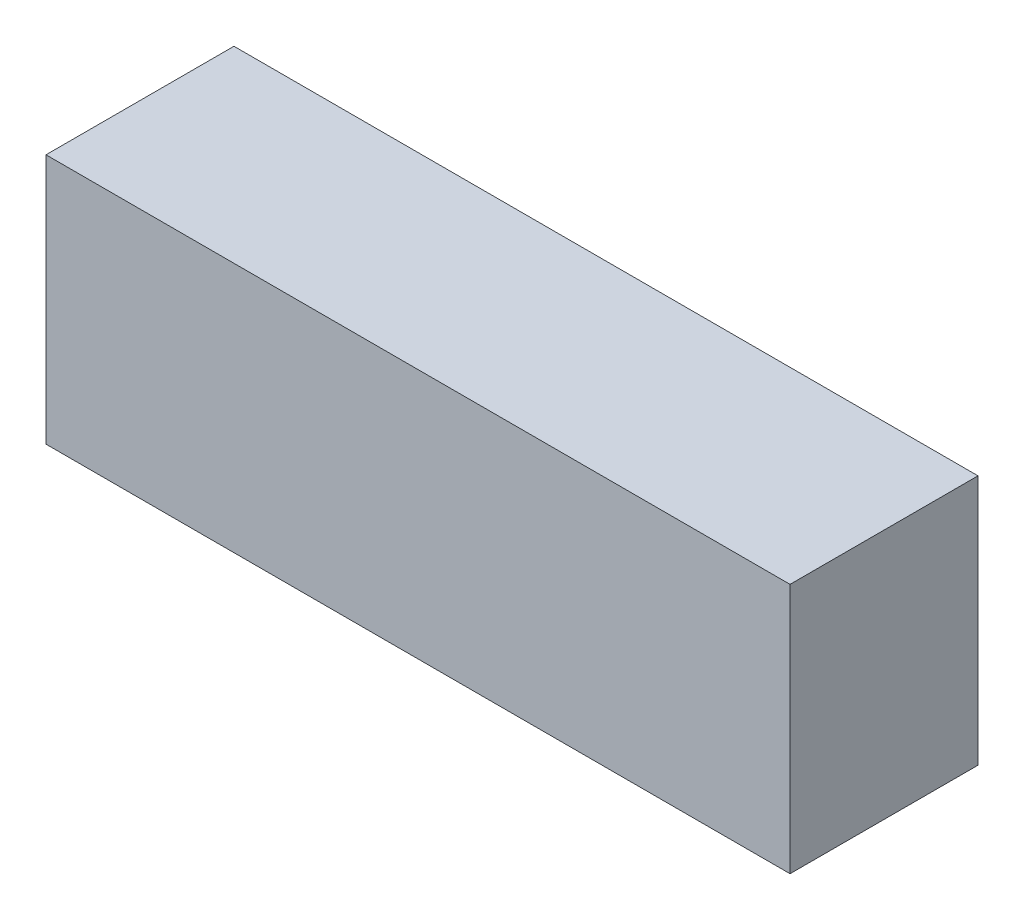
ISO-10303-21;
HEADER;
FILE_DESCRIPTION(('STEP AP214'),'2;1');
FILE_NAME('part.step','',(''),(''),'','','');
FILE_SCHEMA(('AUTOMOTIVE_DESIGN { 1 0 10303 214 1 1 1 1 }'));
ENDSEC;
DATA;
#1=APPLICATION_CONTEXT('core data for automotive mechanical design processes');
#2=APPLICATION_PROTOCOL_DEFINITION('international standard','automotive_design',2000,#1);
#3=PRODUCT_CONTEXT('',#1,'mechanical');
#4=PRODUCT('Part','Part','',(#3));
#5=PRODUCT_RELATED_PRODUCT_CATEGORY('part','',(#4));
#6=PRODUCT_DEFINITION_FORMATION('','',#4);
#7=PRODUCT_DEFINITION_CONTEXT('part definition',#1,'design');
#8=PRODUCT_DEFINITION('design','',#6,#7);
#9=PRODUCT_DEFINITION_SHAPE('','',#8);
#10=(LENGTH_UNIT() NAMED_UNIT(*) SI_UNIT(.MILLI.,.METRE.));
#11=(NAMED_UNIT(*) PLANE_ANGLE_UNIT() SI_UNIT($,.RADIAN.));
#12=(NAMED_UNIT(*) SI_UNIT($,.STERADIAN.) SOLID_ANGLE_UNIT());
#13=UNCERTAINTY_MEASURE_WITH_UNIT(LENGTH_MEASURE(1.E-05),#10,'distance_accuracy_value','');
#14=(GEOMETRIC_REPRESENTATION_CONTEXT(3) GLOBAL_UNCERTAINTY_ASSIGNED_CONTEXT((#13)) GLOBAL_UNIT_ASSIGNED_CONTEXT((#10,
#11,#12)) REPRESENTATION_CONTEXT('',''));
#15=CARTESIAN_POINT('',(0.,0.,0.));
#16=DIRECTION('',(0.,0.,1.));
#17=DIRECTION('',(1.,0.,0.));
#18=AXIS2_PLACEMENT_3D('',#15,#16,#17);
#19=CARTESIAN_POINT('',(0.,-173.,24.));
#20=DIRECTION('',(0.,0.,1.));
#21=DIRECTION('',(1.,0.,0.));
#22=AXIS2_PLACEMENT_3D('',#19,#20,#21);
#23=PLANE('',#22);
#24=CARTESIAN_POINT('',(0.,-173.,24.));
#25=CARTESIAN_POINT('',(95.,-173.,24.));
#26=(BOUNDED_CURVE() B_SPLINE_CURVE(1,(#24,#25),.UNSPECIFIED.,.F.,
.F.) B_SPLINE_CURVE_WITH_KNOTS((2,2),(0.,95.),
.UNSPECIFIED.) CURVE() GEOMETRIC_REPRESENTATION_ITEM() RATIONAL_B_SPLINE_CURVE((1.,1.)) REPRESENTATION_ITEM(''));
#27=CARTESIAN_POINT('',(0.,-173.,24.));
#28=VERTEX_POINT('',#27);
#29=CARTESIAN_POINT('',(95.,-173.,24.));
#30=VERTEX_POINT('',#29);
#31=EDGE_CURVE('E83',#28,#30,#26,.T.);
#32=ORIENTED_EDGE('',*,*,#31,.T.);
#33=CARTESIAN_POINT('',(95.,-173.,24.));
#34=CARTESIAN_POINT('',(95.,-141.,24.));
#35=(BOUNDED_CURVE() B_SPLINE_CURVE(1,(#33,#34),.UNSPECIFIED.,.F.,
.F.) B_SPLINE_CURVE_WITH_KNOTS((2,2),(95.,127.),
.UNSPECIFIED.) CURVE() GEOMETRIC_REPRESENTATION_ITEM() RATIONAL_B_SPLINE_CURVE((1.,1.)) REPRESENTATION_ITEM(''));
#36=CARTESIAN_POINT('',(95.,-141.,24.));
#37=VERTEX_POINT('',#36);
#38=EDGE_CURVE('E100',#30,#37,#35,.T.);
#39=ORIENTED_EDGE('',*,*,#38,.T.);
#40=CARTESIAN_POINT('',(95.,-141.,24.));
#41=CARTESIAN_POINT('',(0.,-141.,24.));
#42=(BOUNDED_CURVE() B_SPLINE_CURVE(1,(#40,#41),.UNSPECIFIED.,.F.,
.F.) B_SPLINE_CURVE_WITH_KNOTS((2,2),(127.,222.),
.UNSPECIFIED.) CURVE() GEOMETRIC_REPRESENTATION_ITEM() RATIONAL_B_SPLINE_CURVE((1.,1.)) REPRESENTATION_ITEM(''));
#43=CARTESIAN_POINT('',(0.,-141.,24.));
#44=VERTEX_POINT('',#43);
#45=EDGE_CURVE('E75',#37,#44,#42,.T.);
#46=ORIENTED_EDGE('',*,*,#45,.T.);
#47=CARTESIAN_POINT('',(0.,-141.,24.));
#48=CARTESIAN_POINT('',(0.,-173.,24.));
#49=(BOUNDED_CURVE() B_SPLINE_CURVE(1,(#47,#48),.UNSPECIFIED.,.F.,
.F.) B_SPLINE_CURVE_WITH_KNOTS((2,2),(222.,254.),
.UNSPECIFIED.) CURVE() GEOMETRIC_REPRESENTATION_ITEM() RATIONAL_B_SPLINE_CURVE((1.,1.)) REPRESENTATION_ITEM(''));
#50=EDGE_CURVE('E10',#44,#28,#49,.T.);
#51=ORIENTED_EDGE('',*,*,#50,.T.);
#52=EDGE_LOOP('',(#32,#39,#46,#51));
#53=FACE_BOUND('',#52,.T.);
#54=ADVANCED_FACE('F16',(#53),#23,.T.);
#55=CARTESIAN_POINT('',(0.,-173.,0.));
#56=DIRECTION('',(0.,0.,-1.));
#57=DIRECTION('',(0.,-1.,0.));
#58=AXIS2_PLACEMENT_3D('',#55,#56,#57);
#59=PLANE('',#58);
#60=CARTESIAN_POINT('',(0.,-141.,0.));
#61=CARTESIAN_POINT('',(0.,-173.,0.));
#62=(BOUNDED_CURVE() B_SPLINE_CURVE(1,(#60,#61),.UNSPECIFIED.,.F.,
.F.) B_SPLINE_CURVE_WITH_KNOTS((2,2),(222.,254.),
.UNSPECIFIED.) CURVE() GEOMETRIC_REPRESENTATION_ITEM() RATIONAL_B_SPLINE_CURVE((1.,1.)) REPRESENTATION_ITEM(''));
#63=CARTESIAN_POINT('',(0.,-141.,0.));
#64=VERTEX_POINT('',#63);
#65=CARTESIAN_POINT('',(0.,-173.,0.));
#66=VERTEX_POINT('',#65);
#67=EDGE_CURVE('E26',#64,#66,#62,.T.);
#68=ORIENTED_EDGE('',*,*,#67,.F.);
#69=CARTESIAN_POINT('',(95.,-141.,0.));
#70=CARTESIAN_POINT('',(0.,-141.,0.));
#71=(BOUNDED_CURVE() B_SPLINE_CURVE(1,(#69,#70),.UNSPECIFIED.,.F.,
.F.) B_SPLINE_CURVE_WITH_KNOTS((2,2),(127.,222.),
.UNSPECIFIED.) CURVE() GEOMETRIC_REPRESENTATION_ITEM() RATIONAL_B_SPLINE_CURVE((1.,1.)) REPRESENTATION_ITEM(''));
#72=CARTESIAN_POINT('',(95.,-141.,0.));
#73=VERTEX_POINT('',#72);
#74=EDGE_CURVE('E142',#73,#64,#71,.T.);
#75=ORIENTED_EDGE('',*,*,#74,.F.);
#76=CARTESIAN_POINT('',(95.,-173.,0.));
#77=CARTESIAN_POINT('',(95.,-141.,0.));
#78=(BOUNDED_CURVE() B_SPLINE_CURVE(1,(#76,#77),.UNSPECIFIED.,.F.,
.F.) B_SPLINE_CURVE_WITH_KNOTS((2,2),(95.,127.),
.UNSPECIFIED.) CURVE() GEOMETRIC_REPRESENTATION_ITEM() RATIONAL_B_SPLINE_CURVE((1.,1.)) REPRESENTATION_ITEM(''));
#79=CARTESIAN_POINT('',(95.,-173.,0.));
#80=VERTEX_POINT('',#79);
#81=EDGE_CURVE('E85',#80,#73,#78,.T.);
#82=ORIENTED_EDGE('',*,*,#81,.F.);
#83=CARTESIAN_POINT('',(0.,-173.,0.));
#84=CARTESIAN_POINT('',(95.,-173.,0.));
#85=(BOUNDED_CURVE() B_SPLINE_CURVE(1,(#83,#84),.UNSPECIFIED.,.F.,
.F.) B_SPLINE_CURVE_WITH_KNOTS((2,2),(0.,95.),
.UNSPECIFIED.) CURVE() GEOMETRIC_REPRESENTATION_ITEM() RATIONAL_B_SPLINE_CURVE((1.,1.)) REPRESENTATION_ITEM(''));
#86=EDGE_CURVE('E81',#66,#80,#85,.T.);
#87=ORIENTED_EDGE('',*,*,#86,.F.);
#88=EDGE_LOOP('',(#68,#75,#82,#87));
#89=FACE_BOUND('',#88,.T.);
#90=ADVANCED_FACE('F87',(#89),#59,.T.);
#91=CARTESIAN_POINT('',(0.,-141.,0.));
#92=DIRECTION('',(-1.,0.,0.));
#93=DIRECTION('',(0.,0.,1.));
#94=AXIS2_PLACEMENT_3D('',#91,#92,#93);
#95=PLANE('',#94);
#96=ORIENTED_EDGE('',*,*,#67,.T.);
#97=CARTESIAN_POINT('',(0.,-173.,0.));
#98=CARTESIAN_POINT('',(0.,-173.,24.));
#99=(BOUNDED_CURVE() B_SPLINE_CURVE(1,(#97,#98),.UNSPECIFIED.,.F.,
.F.) B_SPLINE_CURVE_WITH_KNOTS((2,2),(0.,24.),
.UNSPECIFIED.) CURVE() GEOMETRIC_REPRESENTATION_ITEM() RATIONAL_B_SPLINE_CURVE((1.,1.)) REPRESENTATION_ITEM(''));
#100=EDGE_CURVE('E69',#66,#28,#99,.T.);
#101=ORIENTED_EDGE('',*,*,#100,.T.);
#102=ORIENTED_EDGE('',*,*,#50,.F.);
#103=CARTESIAN_POINT('',(0.,-141.,0.));
#104=CARTESIAN_POINT('',(0.,-141.,24.));
#105=(BOUNDED_CURVE() B_SPLINE_CURVE(1,(#103,#104),.UNSPECIFIED.,.F.,
.F.) B_SPLINE_CURVE_WITH_KNOTS((2,2),(0.,24.),
.UNSPECIFIED.) CURVE() GEOMETRIC_REPRESENTATION_ITEM() RATIONAL_B_SPLINE_CURVE((1.,1.)) REPRESENTATION_ITEM(''));
#106=EDGE_CURVE('E72',#64,#44,#105,.T.);
#107=ORIENTED_EDGE('',*,*,#106,.F.);
#108=EDGE_LOOP('',(#96,#101,#102,#107));
#109=FACE_BOUND('',#108,.T.);
#110=ADVANCED_FACE('F68',(#109),#95,.T.);
#111=CARTESIAN_POINT('',(95.,-141.,0.));
#112=DIRECTION('',(0.,1.,0.));
#113=DIRECTION('',(1.,0.,0.));
#114=AXIS2_PLACEMENT_3D('',#111,#112,#113);
#115=PLANE('',#114);
#116=ORIENTED_EDGE('',*,*,#74,.T.);
#117=ORIENTED_EDGE('',*,*,#106,.T.);
#118=ORIENTED_EDGE('',*,*,#45,.F.);
#119=CARTESIAN_POINT('',(95.,-141.,0.));
#120=CARTESIAN_POINT('',(95.,-141.,24.));
#121=(BOUNDED_CURVE() B_SPLINE_CURVE(1,(#119,#120),.UNSPECIFIED.,.F.,
.F.) B_SPLINE_CURVE_WITH_KNOTS((2,2),(0.,24.),
.UNSPECIFIED.) CURVE() GEOMETRIC_REPRESENTATION_ITEM() RATIONAL_B_SPLINE_CURVE((1.,1.)) REPRESENTATION_ITEM(''));
#122=EDGE_CURVE('E116',#73,#37,#121,.T.);
#123=ORIENTED_EDGE('',*,*,#122,.F.);
#124=EDGE_LOOP('',(#116,#117,#118,#123));
#125=FACE_BOUND('',#124,.T.);
#126=ADVANCED_FACE('F167',(#125),#115,.T.);
#127=CARTESIAN_POINT('',(95.,-173.,0.));
#128=DIRECTION('',(1.,0.,0.));
#129=DIRECTION('',(0.,1.,0.));
#130=AXIS2_PLACEMENT_3D('',#127,#128,#129);
#131=PLANE('',#130);
#132=ORIENTED_EDGE('',*,*,#81,.T.);
#133=ORIENTED_EDGE('',*,*,#122,.T.);
#134=ORIENTED_EDGE('',*,*,#38,.F.);
#135=CARTESIAN_POINT('',(95.,-173.,0.));
#136=CARTESIAN_POINT('',(95.,-173.,24.));
#137=(BOUNDED_CURVE() B_SPLINE_CURVE(1,(#135,#136),.UNSPECIFIED.,.F.,
.F.) B_SPLINE_CURVE_WITH_KNOTS((2,2),(0.,24.),
.UNSPECIFIED.) CURVE() GEOMETRIC_REPRESENTATION_ITEM() RATIONAL_B_SPLINE_CURVE((1.,1.)) REPRESENTATION_ITEM(''));
#138=EDGE_CURVE('E91',#80,#30,#137,.T.);
#139=ORIENTED_EDGE('',*,*,#138,.F.);
#140=EDGE_LOOP('',(#132,#133,#134,#139));
#141=FACE_BOUND('',#140,.T.);
#142=ADVANCED_FACE('F171',(#141),#131,.T.);
#143=CARTESIAN_POINT('',(0.,-173.,0.));
#144=DIRECTION('',(0.,-1.,0.));
#145=DIRECTION('',(0.,0.,-1.));
#146=AXIS2_PLACEMENT_3D('',#143,#144,#145);
#147=PLANE('',#146);
#148=ORIENTED_EDGE('',*,*,#86,.T.);
#149=ORIENTED_EDGE('',*,*,#138,.T.);
#150=ORIENTED_EDGE('',*,*,#31,.F.);
#151=ORIENTED_EDGE('',*,*,#100,.F.);
#152=EDGE_LOOP('',(#148,#149,#150,#151));
#153=FACE_BOUND('',#152,.T.);
#154=ADVANCED_FACE('F79',(#153),#147,.T.);
#155=CLOSED_SHELL('',(#54,#90,#110,#126,#142,#154));
#156=MANIFOLD_SOLID_BREP('B1',#155);
#157=ADVANCED_BREP_SHAPE_REPRESENTATION('',(#18,#156),#14);
#158=SHAPE_DEFINITION_REPRESENTATION(#9,#157);
ENDSEC;
END-ISO-10303-21;
